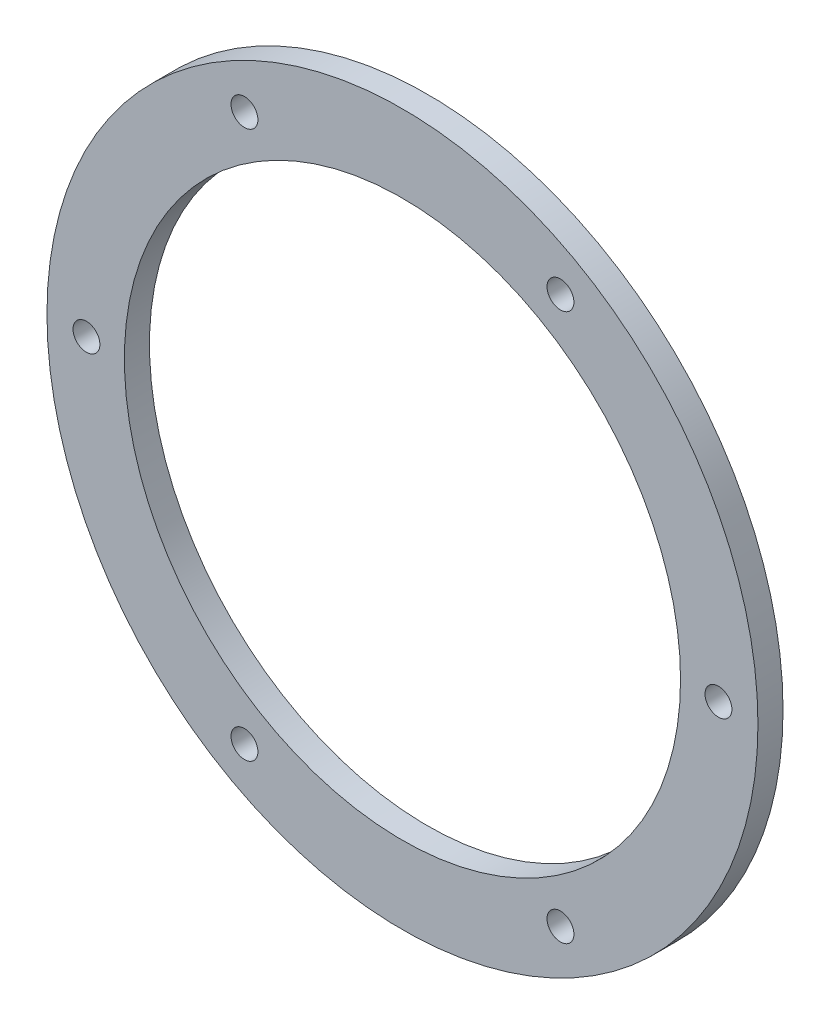
ISO-10303-21;
HEADER;
FILE_DESCRIPTION(('STEP AP214'),'2;1');
FILE_NAME('part.step','',(''),(''),'','','');
FILE_SCHEMA(('AUTOMOTIVE_DESIGN { 1 0 10303 214 1 1 1 1 }'));
ENDSEC;
DATA;
#1=APPLICATION_CONTEXT('core data for automotive mechanical design processes');
#2=APPLICATION_PROTOCOL_DEFINITION('international standard','automotive_design',2000,#1);
#3=PRODUCT_CONTEXT('',#1,'mechanical');
#4=PRODUCT('Part','Part','',(#3));
#5=PRODUCT_RELATED_PRODUCT_CATEGORY('part','',(#4));
#6=PRODUCT_DEFINITION_FORMATION('','',#4);
#7=PRODUCT_DEFINITION_CONTEXT('part definition',#1,'design');
#8=PRODUCT_DEFINITION('design','',#6,#7);
#9=PRODUCT_DEFINITION_SHAPE('','',#8);
#10=(LENGTH_UNIT() NAMED_UNIT(*) SI_UNIT(.MILLI.,.METRE.));
#11=(NAMED_UNIT(*) PLANE_ANGLE_UNIT() SI_UNIT($,.RADIAN.));
#12=(NAMED_UNIT(*) SI_UNIT($,.STERADIAN.) SOLID_ANGLE_UNIT());
#13=UNCERTAINTY_MEASURE_WITH_UNIT(LENGTH_MEASURE(1.E-05),#10,'distance_accuracy_value','');
#14=(GEOMETRIC_REPRESENTATION_CONTEXT(3) GLOBAL_UNCERTAINTY_ASSIGNED_CONTEXT((#13)) GLOBAL_UNIT_ASSIGNED_CONTEXT((#10,
#11,#12)) REPRESENTATION_CONTEXT('',''));
#15=CARTESIAN_POINT('',(0.,0.,0.));
#16=DIRECTION('',(0.,0.,1.));
#17=DIRECTION('',(1.,0.,0.));
#18=AXIS2_PLACEMENT_3D('',#15,#16,#17);
#19=CARTESIAN_POINT('',(0.,0.,73.025));
#20=DIRECTION('',(0.,0.,1.));
#21=DIRECTION('',(1.,0.,0.));
#22=AXIS2_PLACEMENT_3D('',#19,#20,#21);
#23=PLANE('',#22);
#24=CARTESIAN_POINT('',(40.,0.,73.025));
#25=DIRECTION('',(0.,0.,1.));
#26=DIRECTION('',(1.,0.,0.));
#27=AXIS2_PLACEMENT_3D('',#24,#25,#26);
#28=CIRCLE('',#27,1.7);
#29=CARTESIAN_POINT('',(41.7,0.,73.025));
#30=VERTEX_POINT('',#29);
#31=EDGE_CURVE('E62',#30,#30,#28,.T.);
#32=ORIENTED_EDGE('',*,*,#31,.F.);
#33=EDGE_LOOP('',(#32));
#34=FACE_BOUND('',#33,.T.);
#35=CARTESIAN_POINT('',(20.,-34.6410161513775,73.025));
#36=DIRECTION('',(0.,0.,1.));
#37=DIRECTION('',(1.,0.,0.));
#38=AXIS2_PLACEMENT_3D('',#35,#36,#37);
#39=CIRCLE('',#38,1.7);
#40=CARTESIAN_POINT('',(21.7,-34.6410161513775,73.025));
#41=VERTEX_POINT('',#40);
#42=EDGE_CURVE('E99',#41,#41,#39,.T.);
#43=ORIENTED_EDGE('',*,*,#42,.F.);
#44=EDGE_LOOP('',(#43));
#45=FACE_BOUND('',#44,.T.);
#46=CARTESIAN_POINT('',(-20.,-34.6410161513775,73.025));
#47=DIRECTION('',(0.,0.,1.));
#48=DIRECTION('',(1.,0.,0.));
#49=AXIS2_PLACEMENT_3D('',#46,#47,#48);
#50=CIRCLE('',#49,1.7);
#51=CARTESIAN_POINT('',(-18.3,-34.6410161513775,73.025));
#52=VERTEX_POINT('',#51);
#53=EDGE_CURVE('E66',#52,#52,#50,.T.);
#54=ORIENTED_EDGE('',*,*,#53,.F.);
#55=EDGE_LOOP('',(#54));
#56=FACE_BOUND('',#55,.T.);
#57=CARTESIAN_POINT('',(-40.,0.,73.025));
#58=DIRECTION('',(0.,0.,1.));
#59=DIRECTION('',(1.,0.,0.));
#60=AXIS2_PLACEMENT_3D('',#57,#58,#59);
#61=CIRCLE('',#60,1.7);
#62=CARTESIAN_POINT('',(-38.3,0.,73.025));
#63=VERTEX_POINT('',#62);
#64=EDGE_CURVE('E73',#63,#63,#61,.T.);
#65=ORIENTED_EDGE('',*,*,#64,.F.);
#66=EDGE_LOOP('',(#65));
#67=FACE_BOUND('',#66,.T.);
#68=CARTESIAN_POINT('',(-20.,34.6410161513776,73.025));
#69=DIRECTION('',(0.,0.,1.));
#70=DIRECTION('',(1.,0.,0.));
#71=AXIS2_PLACEMENT_3D('',#68,#69,#70);
#72=CIRCLE('',#71,1.7);
#73=CARTESIAN_POINT('',(-18.3,34.6410161513776,73.025));
#74=VERTEX_POINT('',#73);
#75=EDGE_CURVE('E84',#74,#74,#72,.T.);
#76=ORIENTED_EDGE('',*,*,#75,.F.);
#77=EDGE_LOOP('',(#76));
#78=FACE_BOUND('',#77,.T.);
#79=CARTESIAN_POINT('',(20.,34.6410161513775,73.025));
#80=DIRECTION('',(0.,0.,1.));
#81=DIRECTION('',(1.,0.,0.));
#82=AXIS2_PLACEMENT_3D('',#79,#80,#81);
#83=CIRCLE('',#82,1.7);
#84=CARTESIAN_POINT('',(21.7,34.6410161513775,73.025));
#85=VERTEX_POINT('',#84);
#86=EDGE_CURVE('E93',#85,#85,#83,.T.);
#87=ORIENTED_EDGE('',*,*,#86,.F.);
#88=EDGE_LOOP('',(#87));
#89=FACE_BOUND('',#88,.T.);
#90=CARTESIAN_POINT('',(0.,0.,73.025));
#91=DIRECTION('',(0.,0.,1.));
#92=DIRECTION('',(1.,0.,0.));
#93=AXIS2_PLACEMENT_3D('',#90,#91,#92);
#94=CIRCLE('',#93,45.);
#95=CARTESIAN_POINT('',(45.,0.,73.025));
#96=VERTEX_POINT('',#95);
#97=EDGE_CURVE('E10',#96,#96,#94,.T.);
#98=ORIENTED_EDGE('',*,*,#97,.T.);
#99=EDGE_LOOP('',(#98));
#100=FACE_BOUND('',#99,.T.);
#101=CARTESIAN_POINT('',(0.,0.,73.025));
#102=DIRECTION('',(0.,0.,1.));
#103=DIRECTION('',(1.,0.,0.));
#104=AXIS2_PLACEMENT_3D('',#101,#102,#103);
#105=CIRCLE('',#104,35.2);
#106=CARTESIAN_POINT('',(35.2,0.,73.025));
#107=VERTEX_POINT('',#106);
#108=EDGE_CURVE('E57',#107,#107,#105,.T.);
#109=ORIENTED_EDGE('',*,*,#108,.F.);
#110=EDGE_LOOP('',(#109));
#111=FACE_BOUND('',#110,.T.);
#112=ADVANCED_FACE('F43',(#34,#45,#56,#67,#78,#89,#100,#111),#23,.T.);
#113=CARTESIAN_POINT('',(0.,0.,69.85));
#114=DIRECTION('',(0.,0.,1.));
#115=DIRECTION('',(1.,0.,0.));
#116=AXIS2_PLACEMENT_3D('',#113,#114,#115);
#117=PLANE('',#116);
#118=CARTESIAN_POINT('',(40.,0.,69.85));
#119=DIRECTION('',(0.,0.,1.));
#120=DIRECTION('',(1.,0.,0.));
#121=AXIS2_PLACEMENT_3D('',#118,#119,#120);
#122=CIRCLE('',#121,1.7);
#123=CARTESIAN_POINT('',(41.7,0.,69.85));
#124=VERTEX_POINT('',#123);
#125=EDGE_CURVE('E97',#124,#124,#122,.T.);
#126=ORIENTED_EDGE('',*,*,#125,.T.);
#127=EDGE_LOOP('',(#126));
#128=FACE_BOUND('',#127,.T.);
#129=CARTESIAN_POINT('',(20.,-34.6410161513775,69.85));
#130=DIRECTION('',(0.,0.,1.));
#131=DIRECTION('',(1.,0.,0.));
#132=AXIS2_PLACEMENT_3D('',#129,#130,#131);
#133=CIRCLE('',#132,1.7);
#134=CARTESIAN_POINT('',(21.7,-34.6410161513775,69.85));
#135=VERTEX_POINT('',#134);
#136=EDGE_CURVE('E72',#135,#135,#133,.T.);
#137=ORIENTED_EDGE('',*,*,#136,.T.);
#138=EDGE_LOOP('',(#137));
#139=FACE_BOUND('',#138,.T.);
#140=CARTESIAN_POINT('',(-20.,-34.6410161513775,69.85));
#141=DIRECTION('',(0.,0.,1.));
#142=DIRECTION('',(1.,0.,0.));
#143=AXIS2_PLACEMENT_3D('',#140,#141,#142);
#144=CIRCLE('',#143,1.7);
#145=CARTESIAN_POINT('',(-18.3,-34.6410161513775,69.85));
#146=VERTEX_POINT('',#145);
#147=EDGE_CURVE('E70',#146,#146,#144,.T.);
#148=ORIENTED_EDGE('',*,*,#147,.T.);
#149=EDGE_LOOP('',(#148));
#150=FACE_BOUND('',#149,.T.);
#151=CARTESIAN_POINT('',(-40.,0.,69.85));
#152=DIRECTION('',(0.,0.,1.));
#153=DIRECTION('',(1.,0.,0.));
#154=AXIS2_PLACEMENT_3D('',#151,#152,#153);
#155=CIRCLE('',#154,1.7);
#156=CARTESIAN_POINT('',(-38.3,0.,69.85));
#157=VERTEX_POINT('',#156);
#158=EDGE_CURVE('E78',#157,#157,#155,.T.);
#159=ORIENTED_EDGE('',*,*,#158,.T.);
#160=EDGE_LOOP('',(#159));
#161=FACE_BOUND('',#160,.T.);
#162=CARTESIAN_POINT('',(-20.,34.6410161513776,69.85));
#163=DIRECTION('',(0.,0.,1.));
#164=DIRECTION('',(1.,0.,0.));
#165=AXIS2_PLACEMENT_3D('',#162,#163,#164);
#166=CIRCLE('',#165,1.7);
#167=CARTESIAN_POINT('',(-18.3,34.6410161513776,69.85));
#168=VERTEX_POINT('',#167);
#169=EDGE_CURVE('E87',#168,#168,#166,.T.);
#170=ORIENTED_EDGE('',*,*,#169,.T.);
#171=EDGE_LOOP('',(#170));
#172=FACE_BOUND('',#171,.T.);
#173=CARTESIAN_POINT('',(20.,34.6410161513775,69.85));
#174=DIRECTION('',(0.,0.,1.));
#175=DIRECTION('',(1.,0.,0.));
#176=AXIS2_PLACEMENT_3D('',#173,#174,#175);
#177=CIRCLE('',#176,1.7);
#178=CARTESIAN_POINT('',(21.7,34.6410161513775,69.85));
#179=VERTEX_POINT('',#178);
#180=EDGE_CURVE('E92',#179,#179,#177,.T.);
#181=ORIENTED_EDGE('',*,*,#180,.T.);
#182=EDGE_LOOP('',(#181));
#183=FACE_BOUND('',#182,.T.);
#184=CARTESIAN_POINT('',(0.,0.,69.85));
#185=DIRECTION('',(0.,0.,1.));
#186=DIRECTION('',(1.,0.,0.));
#187=AXIS2_PLACEMENT_3D('',#184,#185,#186);
#188=CIRCLE('',#187,45.);
#189=CARTESIAN_POINT('',(45.,0.,69.85));
#190=VERTEX_POINT('',#189);
#191=EDGE_CURVE('E50',#190,#190,#188,.T.);
#192=ORIENTED_EDGE('',*,*,#191,.F.);
#193=EDGE_LOOP('',(#192));
#194=FACE_BOUND('',#193,.T.);
#195=CARTESIAN_POINT('',(0.,0.,69.85));
#196=DIRECTION('',(0.,0.,1.));
#197=DIRECTION('',(1.,0.,0.));
#198=AXIS2_PLACEMENT_3D('',#195,#196,#197);
#199=CIRCLE('',#198,35.2);
#200=CARTESIAN_POINT('',(35.2,0.,69.85));
#201=VERTEX_POINT('',#200);
#202=EDGE_CURVE('E59',#201,#201,#199,.T.);
#203=ORIENTED_EDGE('',*,*,#202,.T.);
#204=EDGE_LOOP('',(#203));
#205=FACE_BOUND('',#204,.T.);
#206=ADVANCED_FACE('F118',(#128,#139,#150,#161,#172,#183,#194,#205),#117,.F.);
#207=CARTESIAN_POINT('',(0.,0.,73.025));
#208=DIRECTION('',(0.,0.,-1.));
#209=DIRECTION('',(-1.,0.,0.));
#210=AXIS2_PLACEMENT_3D('',#207,#208,#209);
#211=CYLINDRICAL_SURFACE('',#210,45.);
#212=ORIENTED_EDGE('',*,*,#97,.F.);
#213=EDGE_LOOP('',(#212));
#214=FACE_BOUND('',#213,.T.);
#215=ORIENTED_EDGE('',*,*,#191,.T.);
#216=EDGE_LOOP('',(#215));
#217=FACE_BOUND('',#216,.T.);
#218=ADVANCED_FACE('F44',(#214,#217),#211,.T.);
#219=CARTESIAN_POINT('',(0.,0.,73.025));
#220=DIRECTION('',(0.,0.,-1.));
#221=DIRECTION('',(-1.,0.,0.));
#222=AXIS2_PLACEMENT_3D('',#219,#220,#221);
#223=CYLINDRICAL_SURFACE('',#222,35.2);
#224=ORIENTED_EDGE('',*,*,#108,.T.);
#225=EDGE_LOOP('',(#224));
#226=FACE_BOUND('',#225,.T.);
#227=ORIENTED_EDGE('',*,*,#202,.F.);
#228=EDGE_LOOP('',(#227));
#229=FACE_BOUND('',#228,.T.);
#230=ADVANCED_FACE('F134',(#226,#229),#223,.F.);
#231=CARTESIAN_POINT('',(20.,34.6410161513775,73.025));
#232=DIRECTION('',(0.,0.,-1.));
#233=DIRECTION('',(-1.,0.,0.));
#234=AXIS2_PLACEMENT_3D('',#231,#232,#233);
#235=CYLINDRICAL_SURFACE('',#234,1.7);
#236=ORIENTED_EDGE('',*,*,#86,.T.);
#237=EDGE_LOOP('',(#236));
#238=FACE_BOUND('',#237,.T.);
#239=ORIENTED_EDGE('',*,*,#180,.F.);
#240=EDGE_LOOP('',(#239));
#241=FACE_BOUND('',#240,.T.);
#242=ADVANCED_FACE('F136',(#238,#241),#235,.F.);
#243=CARTESIAN_POINT('',(-20.,34.6410161513776,73.025));
#244=DIRECTION('',(0.,0.,-1.));
#245=DIRECTION('',(-1.,0.,0.));
#246=AXIS2_PLACEMENT_3D('',#243,#244,#245);
#247=CYLINDRICAL_SURFACE('',#246,1.7);
#248=ORIENTED_EDGE('',*,*,#75,.T.);
#249=EDGE_LOOP('',(#248));
#250=FACE_BOUND('',#249,.T.);
#251=ORIENTED_EDGE('',*,*,#169,.F.);
#252=EDGE_LOOP('',(#251));
#253=FACE_BOUND('',#252,.T.);
#254=ADVANCED_FACE('F160',(#250,#253),#247,.F.);
#255=CARTESIAN_POINT('',(-40.,0.,73.025));
#256=DIRECTION('',(0.,0.,-1.));
#257=DIRECTION('',(-1.,0.,0.));
#258=AXIS2_PLACEMENT_3D('',#255,#256,#257);
#259=CYLINDRICAL_SURFACE('',#258,1.7);
#260=ORIENTED_EDGE('',*,*,#64,.T.);
#261=EDGE_LOOP('',(#260));
#262=FACE_BOUND('',#261,.T.);
#263=ORIENTED_EDGE('',*,*,#158,.F.);
#264=EDGE_LOOP('',(#263));
#265=FACE_BOUND('',#264,.T.);
#266=ADVANCED_FACE('F153',(#262,#265),#259,.F.);
#267=CARTESIAN_POINT('',(-20.,-34.6410161513775,73.025));
#268=DIRECTION('',(0.,0.,-1.));
#269=DIRECTION('',(-1.,0.,0.));
#270=AXIS2_PLACEMENT_3D('',#267,#268,#269);
#271=CYLINDRICAL_SURFACE('',#270,1.7);
#272=ORIENTED_EDGE('',*,*,#53,.T.);
#273=EDGE_LOOP('',(#272));
#274=FACE_BOUND('',#273,.T.);
#275=ORIENTED_EDGE('',*,*,#147,.F.);
#276=EDGE_LOOP('',(#275));
#277=FACE_BOUND('',#276,.T.);
#278=ADVANCED_FACE('F149',(#274,#277),#271,.F.);
#279=CARTESIAN_POINT('',(20.,-34.6410161513775,73.025));
#280=DIRECTION('',(0.,0.,-1.));
#281=DIRECTION('',(-1.,0.,0.));
#282=AXIS2_PLACEMENT_3D('',#279,#280,#281);
#283=CYLINDRICAL_SURFACE('',#282,1.7);
#284=ORIENTED_EDGE('',*,*,#42,.T.);
#285=EDGE_LOOP('',(#284));
#286=FACE_BOUND('',#285,.T.);
#287=ORIENTED_EDGE('',*,*,#136,.F.);
#288=EDGE_LOOP('',(#287));
#289=FACE_BOUND('',#288,.T.);
#290=ADVANCED_FACE('F155',(#286,#289),#283,.F.);
#291=CARTESIAN_POINT('',(40.,0.,73.025));
#292=DIRECTION('',(0.,0.,-1.));
#293=DIRECTION('',(-1.,0.,0.));
#294=AXIS2_PLACEMENT_3D('',#291,#292,#293);
#295=CYLINDRICAL_SURFACE('',#294,1.7);
#296=ORIENTED_EDGE('',*,*,#31,.T.);
#297=EDGE_LOOP('',(#296));
#298=FACE_BOUND('',#297,.T.);
#299=ORIENTED_EDGE('',*,*,#125,.F.);
#300=EDGE_LOOP('',(#299));
#301=FACE_BOUND('',#300,.T.);
#302=ADVANCED_FACE('F111',(#298,#301),#295,.F.);
#303=CLOSED_SHELL('',(#112,#206,#218,#230,#242,#254,#266,#278,#290,#302));
#304=MANIFOLD_SOLID_BREP('B2',#303);
#305=ADVANCED_BREP_SHAPE_REPRESENTATION('',(#18,#304),#14);
#306=SHAPE_DEFINITION_REPRESENTATION(#9,#305);
ENDSEC;
END-ISO-10303-21;
